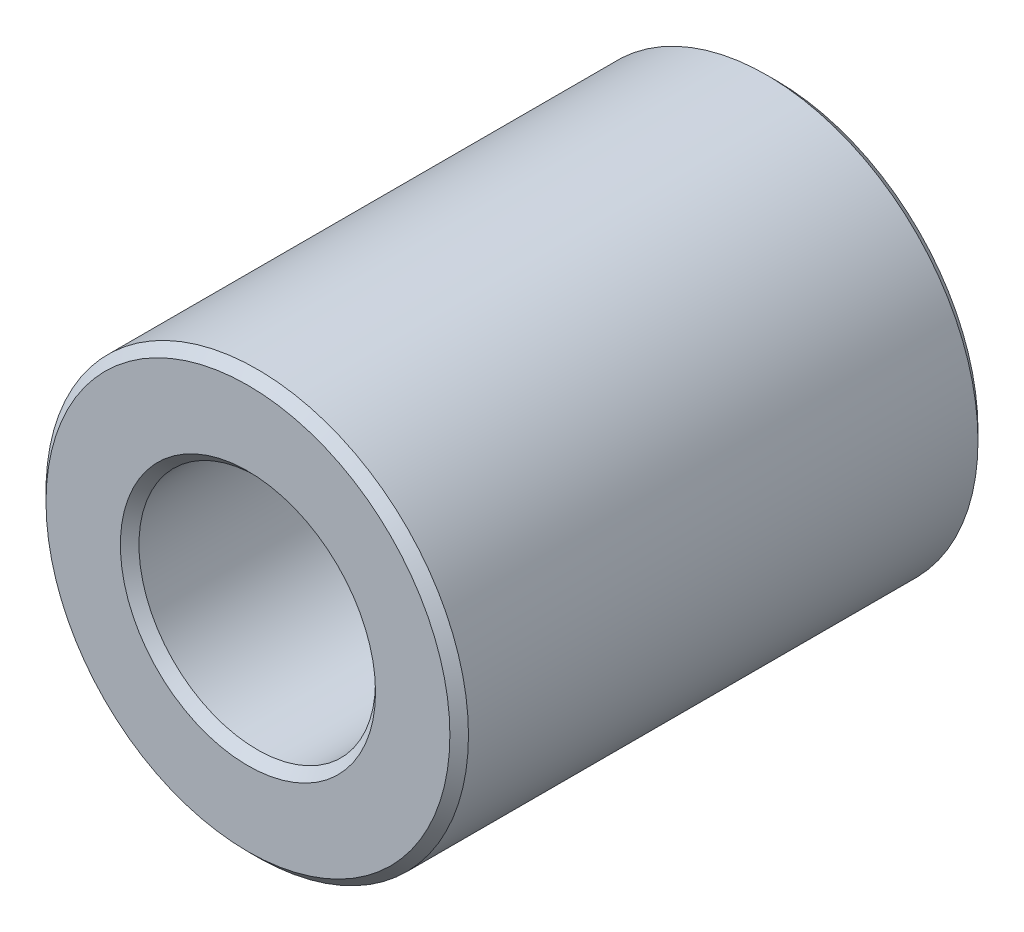
ISO-10303-21;
HEADER;
FILE_DESCRIPTION(('STEP AP214'),'2;1');
FILE_NAME('part.step','',(''),(''),'','','');
FILE_SCHEMA(('AUTOMOTIVE_DESIGN { 1 0 10303 214 1 1 1 1 }'));
ENDSEC;
DATA;
#1=APPLICATION_CONTEXT('core data for automotive mechanical design processes');
#2=APPLICATION_PROTOCOL_DEFINITION('international standard','automotive_design',2000,#1);
#3=PRODUCT_CONTEXT('',#1,'mechanical');
#4=PRODUCT('Part','Part','',(#3));
#5=PRODUCT_RELATED_PRODUCT_CATEGORY('part','',(#4));
#6=PRODUCT_DEFINITION_FORMATION('','',#4);
#7=PRODUCT_DEFINITION_CONTEXT('part definition',#1,'design');
#8=PRODUCT_DEFINITION('design','',#6,#7);
#9=PRODUCT_DEFINITION_SHAPE('','',#8);
#10=(LENGTH_UNIT() NAMED_UNIT(*) SI_UNIT(.MILLI.,.METRE.));
#11=(NAMED_UNIT(*) PLANE_ANGLE_UNIT() SI_UNIT($,.RADIAN.));
#12=(NAMED_UNIT(*) SI_UNIT($,.STERADIAN.) SOLID_ANGLE_UNIT());
#13=UNCERTAINTY_MEASURE_WITH_UNIT(LENGTH_MEASURE(1.E-05),#10,'distance_accuracy_value','');
#14=(GEOMETRIC_REPRESENTATION_CONTEXT(3) GLOBAL_UNCERTAINTY_ASSIGNED_CONTEXT((#13)) GLOBAL_UNIT_ASSIGNED_CONTEXT((#10,
#11,#12)) REPRESENTATION_CONTEXT('',''));
#15=CARTESIAN_POINT('',(0.,0.,0.));
#16=DIRECTION('',(0.,0.,1.));
#17=DIRECTION('',(1.,0.,0.));
#18=AXIS2_PLACEMENT_3D('',#15,#16,#17);
#19=CARTESIAN_POINT('',(0.,0.,-3.96875));
#20=DIRECTION('',(0.,0.,1.));
#21=DIRECTION('',(1.,0.,0.));
#22=AXIS2_PLACEMENT_3D('',#19,#20,#21);
#23=CYLINDRICAL_SURFACE('',#22,3.175);
#24=CARTESIAN_POINT('',(0.,0.,3.82905));
#25=DIRECTION('',(0.,0.,1.));
#26=DIRECTION('',(1.,0.,0.));
#27=AXIS2_PLACEMENT_3D('',#24,#25,#26);
#28=CIRCLE('',#27,3.175);
#29=CARTESIAN_POINT('',(3.175,0.,3.82905));
#30=VERTEX_POINT('',#29);
#31=EDGE_CURVE('E50',#30,#30,#28,.F.);
#32=CARTESIAN_POINT('',(0.,0.,-3.82905));
#33=DIRECTION('',(0.,0.,1.));
#34=DIRECTION('',(1.,0.,0.));
#35=AXIS2_PLACEMENT_3D('',#32,#33,#34);
#36=CIRCLE('',#35,3.175);
#37=CARTESIAN_POINT('',(3.175,0.,-3.82905));
#38=VERTEX_POINT('',#37);
#39=EDGE_CURVE('E53',#38,#38,#36,.T.);
#40=CARTESIAN_POINT('',(3.175,0.,3.82905));
#41=CARTESIAN_POINT('',(3.175,0.,3.749278125));
#42=CARTESIAN_POINT('',(3.175,0.,3.66950625));
#43=CARTESIAN_POINT('',(3.175,0.,3.5099625));
#44=CARTESIAN_POINT('',(3.175,0.,3.430190625));
#45=CARTESIAN_POINT('',(3.175,0.,3.270646875));
#46=CARTESIAN_POINT('',(3.175,0.,3.190875));
#47=CARTESIAN_POINT('',(3.175,0.,3.03133125));
#48=CARTESIAN_POINT('',(3.175,0.,2.951559375));
#49=CARTESIAN_POINT('',(3.175,0.,2.792015625));
#50=CARTESIAN_POINT('',(3.175,0.,2.71224375));
#51=CARTESIAN_POINT('',(3.175,0.,2.5527));
#52=CARTESIAN_POINT('',(3.175,0.,2.472928125));
#53=CARTESIAN_POINT('',(3.175,0.,2.313384375));
#54=CARTESIAN_POINT('',(3.175,0.,2.2336125));
#55=CARTESIAN_POINT('',(3.175,0.,2.07406875));
#56=CARTESIAN_POINT('',(3.175,0.,1.994296875));
#57=CARTESIAN_POINT('',(3.175,0.,1.834753125));
#58=CARTESIAN_POINT('',(3.175,0.,1.75498125));
#59=CARTESIAN_POINT('',(3.175,0.,1.5954375));
#60=CARTESIAN_POINT('',(3.175,0.,1.515665625));
#61=CARTESIAN_POINT('',(3.175,0.,1.356121875));
#62=CARTESIAN_POINT('',(3.175,0.,1.27635));
#63=CARTESIAN_POINT('',(3.175,0.,1.11680625));
#64=CARTESIAN_POINT('',(3.175,0.,1.037034375));
#65=CARTESIAN_POINT('',(3.175,0.,0.877490625));
#66=CARTESIAN_POINT('',(3.175,0.,0.79771875));
#67=CARTESIAN_POINT('',(3.175,0.,0.638175));
#68=CARTESIAN_POINT('',(3.175,0.,0.558403125));
#69=CARTESIAN_POINT('',(3.175,0.,0.398859375));
#70=CARTESIAN_POINT('',(3.175,0.,0.3190875));
#71=CARTESIAN_POINT('',(3.175,0.,0.15954375));
#72=CARTESIAN_POINT('',(3.175,0.,0.079771875));
#73=CARTESIAN_POINT('',(3.175,0.,-0.079771875));
#74=CARTESIAN_POINT('',(3.175,0.,-0.15954375));
#75=CARTESIAN_POINT('',(3.175,0.,-0.3190875));
#76=CARTESIAN_POINT('',(3.175,0.,-0.398859375));
#77=CARTESIAN_POINT('',(3.175,0.,-0.558403125));
#78=CARTESIAN_POINT('',(3.175,0.,-0.638175));
#79=CARTESIAN_POINT('',(3.175,0.,-0.79771875));
#80=CARTESIAN_POINT('',(3.175,0.,-0.877490625));
#81=CARTESIAN_POINT('',(3.175,0.,-1.037034375));
#82=CARTESIAN_POINT('',(3.175,0.,-1.11680625));
#83=CARTESIAN_POINT('',(3.175,0.,-1.27635));
#84=CARTESIAN_POINT('',(3.175,0.,-1.356121875));
#85=CARTESIAN_POINT('',(3.175,0.,-1.515665625));
#86=CARTESIAN_POINT('',(3.175,0.,-1.5954375));
#87=CARTESIAN_POINT('',(3.175,0.,-1.75498125));
#88=CARTESIAN_POINT('',(3.175,0.,-1.834753125));
#89=CARTESIAN_POINT('',(3.175,0.,-1.994296875));
#90=CARTESIAN_POINT('',(3.175,0.,-2.07406875));
#91=CARTESIAN_POINT('',(3.175,0.,-2.2336125));
#92=CARTESIAN_POINT('',(3.175,0.,-2.313384375));
#93=CARTESIAN_POINT('',(3.175,0.,-2.472928125));
#94=CARTESIAN_POINT('',(3.175,0.,-2.5527));
#95=CARTESIAN_POINT('',(3.175,0.,-2.71224375));
#96=CARTESIAN_POINT('',(3.175,0.,-2.792015625));
#97=CARTESIAN_POINT('',(3.175,0.,-2.951559375));
#98=CARTESIAN_POINT('',(3.175,0.,-3.03133125));
#99=CARTESIAN_POINT('',(3.175,0.,-3.190875));
#100=CARTESIAN_POINT('',(3.175,0.,-3.270646875));
#101=CARTESIAN_POINT('',(3.175,0.,-3.430190625));
#102=CARTESIAN_POINT('',(3.175,0.,-3.5099625));
#103=CARTESIAN_POINT('',(3.175,0.,-3.66950625));
#104=CARTESIAN_POINT('',(3.175,0.,-3.749278125));
#105=CARTESIAN_POINT('',(3.175,0.,-3.82905));
#106=B_SPLINE_CURVE_WITH_KNOTS('',3,(#40,#41,#42,#43,#44,#45,#46,#47,#48,#49,#50,#51,#52,#53,
#54,#55,#56,#57,#58,#59,#60,#61,#62,#63,#64,#65,#66,#67,#68,#69,#70,#71,#72,#73,#74,#75,#76,#77,
#78,#79,#80,#81,#82,#83,#84,#85,#86,#87,#88,#89,#90,#91,#92,#93,#94,#95,#96,#97,#98,#99,#100,
#101,#102,#103,#104,#105),.UNSPECIFIED.,.F.,.F.,(4,2,2,2,2,2,2,2,2,2,2,2,2,2,2,2,2,2,2,2,2,2,2,
2,2,2,2,2,2,2,2,2,4),(0.,0.239315625,0.47863125,0.717946875,0.9572625,1.196578125,1.43589375,
1.675209375,1.914525,2.153840625,2.39315625,2.632471875,2.8717875,3.111103125,3.35041875,
3.589734375,3.82905,4.068365625,4.30768125,4.546996875,4.7863125,5.025628125,5.26494375,
5.504259375,5.743575,5.982890625,6.22220625,6.461521875,6.7008375,6.940153125,7.17946875,
7.418784375,7.6581),.UNSPECIFIED.);
#107=EDGE_CURVE('BSEAM30',#30,#38,#106,.T.);
#108=ORIENTED_EDGE('',*,*,#31,.T.);
#109=ORIENTED_EDGE('',*,*,#39,.T.);
#110=ORIENTED_EDGE('',*,*,#107,.T.);
#111=ORIENTED_EDGE('',*,*,#107,.F.);
#112=EDGE_LOOP('',(#108,#110,#109,#111));
#113=FACE_BOUND('',#112,.T.);
#114=ADVANCED_FACE('F30',(#113),#23,.T.);
#115=CARTESIAN_POINT('',(0.,0.,-3.96875));
#116=DIRECTION('',(0.,0.,1.));
#117=DIRECTION('',(1.,0.,0.));
#118=AXIS2_PLACEMENT_3D('',#115,#116,#117);
#119=PLANE('',#118);
#120=CARTESIAN_POINT('',(0.,0.,-3.96875));
#121=DIRECTION('',(0.,0.,1.));
#122=DIRECTION('',(1.,0.,0.));
#123=AXIS2_PLACEMENT_3D('',#120,#121,#122);
#124=CIRCLE('',#123,3.0353);
#125=CARTESIAN_POINT('',(3.0353,0.,-3.96875));
#126=VERTEX_POINT('',#125);
#127=EDGE_CURVE('E41',#126,#126,#124,.F.);
#128=ORIENTED_EDGE('',*,*,#127,.T.);
#129=EDGE_LOOP('',(#128));
#130=FACE_BOUND('',#129,.T.);
#131=CARTESIAN_POINT('',(0.,0.,-3.96875));
#132=DIRECTION('',(0.,0.,1.));
#133=DIRECTION('',(1.,0.,0.));
#134=AXIS2_PLACEMENT_3D('',#131,#132,#133);
#135=CIRCLE('',#134,1.9177);
#136=CARTESIAN_POINT('',(-1.9177,0.,-3.96875));
#137=VERTEX_POINT('',#136);
#138=EDGE_CURVE('E45',#137,#137,#135,.T.);
#139=ORIENTED_EDGE('',*,*,#138,.T.);
#140=EDGE_LOOP('',(#139));
#141=FACE_BOUND('',#140,.T.);
#142=ADVANCED_FACE('F78',(#130,#141),#119,.F.);
#143=CARTESIAN_POINT('',(0.,0.,-3.96875));
#144=DIRECTION('',(0.,0.,1.));
#145=DIRECTION('',(1.,0.,0.));
#146=AXIS2_PLACEMENT_3D('',#143,#144,#145);
#147=CYLINDRICAL_SURFACE('',#146,1.778);
#148=CARTESIAN_POINT('',(0.,0.,3.82905));
#149=DIRECTION('',(0.,0.,1.));
#150=DIRECTION('',(1.,0.,0.));
#151=AXIS2_PLACEMENT_3D('',#148,#149,#150);
#152=CIRCLE('',#151,1.778);
#153=CARTESIAN_POINT('',(1.778,0.,3.82905));
#154=VERTEX_POINT('',#153);
#155=EDGE_CURVE('E10',#154,#154,#152,.T.);
#156=ORIENTED_EDGE('',*,*,#155,.T.);
#157=EDGE_LOOP('',(#156));
#158=FACE_BOUND('',#157,.T.);
#159=CARTESIAN_POINT('',(0.,0.,-3.82905));
#160=DIRECTION('',(0.,0.,1.));
#161=DIRECTION('',(1.,0.,0.));
#162=AXIS2_PLACEMENT_3D('',#159,#160,#161);
#163=CIRCLE('',#162,1.778);
#164=CARTESIAN_POINT('',(-1.778,0.,-3.82905));
#165=VERTEX_POINT('',#164);
#166=EDGE_CURVE('E37',#165,#165,#163,.F.);
#167=ORIENTED_EDGE('',*,*,#166,.T.);
#168=EDGE_LOOP('',(#167));
#169=FACE_BOUND('',#168,.T.);
#170=ADVANCED_FACE('F84',(#158,#169),#147,.F.);
#171=CARTESIAN_POINT('',(0.,0.,3.96875));
#172=DIRECTION('',(0.,0.,1.));
#173=DIRECTION('',(1.,0.,0.));
#174=AXIS2_PLACEMENT_3D('',#171,#172,#173);
#175=PLANE('',#174);
#176=CARTESIAN_POINT('',(0.,0.,3.96875));
#177=DIRECTION('',(0.,0.,1.));
#178=DIRECTION('',(1.,0.,0.));
#179=AXIS2_PLACEMENT_3D('',#176,#177,#178);
#180=CIRCLE('',#179,3.0353);
#181=CARTESIAN_POINT('',(3.0353,0.,3.96875));
#182=VERTEX_POINT('',#181);
#183=EDGE_CURVE('E56',#182,#182,#180,.T.);
#184=ORIENTED_EDGE('',*,*,#183,.T.);
#185=EDGE_LOOP('',(#184));
#186=FACE_BOUND('',#185,.T.);
#187=CARTESIAN_POINT('',(0.,0.,3.96875));
#188=DIRECTION('',(0.,0.,1.));
#189=DIRECTION('',(1.,0.,0.));
#190=AXIS2_PLACEMENT_3D('',#187,#188,#189);
#191=CIRCLE('',#190,1.9177);
#192=CARTESIAN_POINT('',(1.9177,0.,3.96875));
#193=VERTEX_POINT('',#192);
#194=EDGE_CURVE('E59',#193,#193,#191,.F.);
#195=ORIENTED_EDGE('',*,*,#194,.T.);
#196=EDGE_LOOP('',(#195));
#197=FACE_BOUND('',#196,.T.);
#198=ADVANCED_FACE('F63',(#186,#197),#175,.T.);
#199=CARTESIAN_POINT('',(0.,0.,3.96875));
#200=DIRECTION('',(0.,0.,-1.));
#201=DIRECTION('',(-1.,0.,0.));
#202=AXIS2_PLACEMENT_3D('',#199,#200,#201);
#203=CONICAL_SURFACE('',#202,3.0353,0.785398163397445);
#204=ORIENTED_EDGE('',*,*,#31,.F.);
#205=EDGE_LOOP('',(#204));
#206=FACE_BOUND('',#205,.T.);
#207=ORIENTED_EDGE('',*,*,#183,.F.);
#208=EDGE_LOOP('',(#207));
#209=FACE_BOUND('',#208,.T.);
#210=ADVANCED_FACE('F74',(#206,#209),#203,.T.);
#211=CARTESIAN_POINT('',(0.,0.,-3.82905));
#212=DIRECTION('',(0.,0.,1.));
#213=DIRECTION('',(1.,0.,0.));
#214=AXIS2_PLACEMENT_3D('',#211,#212,#213);
#215=CONICAL_SURFACE('',#214,3.175,0.785398163397448);
#216=CARTESIAN_POINT('',(3.0353,0.,-3.96875));
#217=CARTESIAN_POINT('',(3.03675520833333,0.,-3.96729479166667));
#218=CARTESIAN_POINT('',(3.03821041666667,0.,-3.96583958333333));
#219=CARTESIAN_POINT('',(3.04112083333333,0.,-3.96292916666667));
#220=CARTESIAN_POINT('',(3.04257604166667,0.,-3.96147395833333));
#221=CARTESIAN_POINT('',(3.04548645833333,0.,-3.95856354166667));
#222=CARTESIAN_POINT('',(3.04694166666667,0.,-3.95710833333333));
#223=CARTESIAN_POINT('',(3.04985208333333,0.,-3.95419791666667));
#224=CARTESIAN_POINT('',(3.05130729166667,0.,-3.95274270833333));
#225=CARTESIAN_POINT('',(3.05421770833333,0.,-3.94983229166667));
#226=CARTESIAN_POINT('',(3.05567291666667,0.,-3.94837708333333));
#227=CARTESIAN_POINT('',(3.05858333333333,0.,-3.94546666666667));
#228=CARTESIAN_POINT('',(3.06003854166667,0.,-3.94401145833333));
#229=CARTESIAN_POINT('',(3.06294895833333,0.,-3.94110104166667));
#230=CARTESIAN_POINT('',(3.06440416666667,0.,-3.93964583333333));
#231=CARTESIAN_POINT('',(3.06731458333333,0.,-3.93673541666667));
#232=CARTESIAN_POINT('',(3.06876979166667,0.,-3.93528020833333));
#233=CARTESIAN_POINT('',(3.07168020833333,0.,-3.93236979166667));
#234=CARTESIAN_POINT('',(3.07313541666667,0.,-3.93091458333333));
#235=CARTESIAN_POINT('',(3.07604583333333,0.,-3.92800416666667));
#236=CARTESIAN_POINT('',(3.07750104166667,0.,-3.92654895833333));
#237=CARTESIAN_POINT('',(3.08041145833333,0.,-3.92363854166667));
#238=CARTESIAN_POINT('',(3.08186666666667,0.,-3.92218333333333));
#239=CARTESIAN_POINT('',(3.08477708333333,0.,-3.91927291666667));
#240=CARTESIAN_POINT('',(3.08623229166667,0.,-3.91781770833333));
#241=CARTESIAN_POINT('',(3.08914270833333,0.,-3.91490729166667));
#242=CARTESIAN_POINT('',(3.09059791666667,0.,-3.91345208333333));
#243=CARTESIAN_POINT('',(3.09350833333333,0.,-3.91054166666667));
#244=CARTESIAN_POINT('',(3.09496354166667,0.,-3.90908645833333));
#245=CARTESIAN_POINT('',(3.09787395833333,0.,-3.90617604166667));
#246=CARTESIAN_POINT('',(3.09932916666667,0.,-3.90472083333333));
#247=CARTESIAN_POINT('',(3.10223958333333,0.,-3.90181041666667));
#248=CARTESIAN_POINT('',(3.10369479166667,0.,-3.90035520833333));
#249=CARTESIAN_POINT('',(3.10660520833333,0.,-3.89744479166667));
#250=CARTESIAN_POINT('',(3.10806041666667,0.,-3.89598958333333));
#251=CARTESIAN_POINT('',(3.11097083333333,0.,-3.89307916666667));
#252=CARTESIAN_POINT('',(3.11242604166667,0.,-3.89162395833333));
#253=CARTESIAN_POINT('',(3.11533645833333,0.,-3.88871354166667));
#254=CARTESIAN_POINT('',(3.11679166666667,0.,-3.88725833333333));
#255=CARTESIAN_POINT('',(3.11970208333333,0.,-3.88434791666667));
#256=CARTESIAN_POINT('',(3.12115729166667,0.,-3.88289270833333));
#257=CARTESIAN_POINT('',(3.12406770833333,0.,-3.87998229166667));
#258=CARTESIAN_POINT('',(3.12552291666667,0.,-3.87852708333333));
#259=CARTESIAN_POINT('',(3.12843333333333,0.,-3.87561666666667));
#260=CARTESIAN_POINT('',(3.12988854166667,0.,-3.87416145833333));
#261=CARTESIAN_POINT('',(3.13279895833333,0.,-3.87125104166667));
#262=CARTESIAN_POINT('',(3.13425416666667,0.,-3.86979583333333));
#263=CARTESIAN_POINT('',(3.13716458333333,0.,-3.86688541666667));
#264=CARTESIAN_POINT('',(3.13861979166667,0.,-3.86543020833333));
#265=CARTESIAN_POINT('',(3.14153020833333,0.,-3.86251979166667));
#266=CARTESIAN_POINT('',(3.14298541666667,0.,-3.86106458333333));
#267=CARTESIAN_POINT('',(3.14589583333333,0.,-3.85815416666667));
#268=CARTESIAN_POINT('',(3.14735104166667,0.,-3.85669895833333));
#269=CARTESIAN_POINT('',(3.15026145833333,0.,-3.85378854166667));
#270=CARTESIAN_POINT('',(3.15171666666667,0.,-3.85233333333333));
#271=CARTESIAN_POINT('',(3.15462708333333,0.,-3.84942291666667));
#272=CARTESIAN_POINT('',(3.15608229166667,0.,-3.84796770833333));
#273=CARTESIAN_POINT('',(3.15899270833333,0.,-3.84505729166667));
#274=CARTESIAN_POINT('',(3.16044791666667,0.,-3.84360208333333));
#275=CARTESIAN_POINT('',(3.16335833333333,0.,-3.84069166666667));
#276=CARTESIAN_POINT('',(3.16481354166667,0.,-3.83923645833333));
#277=CARTESIAN_POINT('',(3.16772395833333,0.,-3.83632604166667));
#278=CARTESIAN_POINT('',(3.16917916666667,0.,-3.83487083333333));
#279=CARTESIAN_POINT('',(3.17208958333333,0.,-3.83196041666667));
#280=CARTESIAN_POINT('',(3.17354479166667,0.,-3.83050520833333));
#281=CARTESIAN_POINT('',(3.175,0.,-3.82905));
#282=B_SPLINE_CURVE_WITH_KNOTS('',3,(#216,#217,#218,#219,#220,#221,#222,#223,#224,#225,#226,
#227,#228,#229,#230,#231,#232,#233,#234,#235,#236,#237,#238,#239,#240,#241,#242,#243,#244,#245,
#246,#247,#248,#249,#250,#251,#252,#253,#254,#255,#256,#257,#258,#259,#260,#261,#262,#263,#264,
#265,#266,#267,#268,#269,#270,#271,#272,#273,#274,#275,#276,#277,#278,#279,#280,#281),
.UNSPECIFIED.,.F.,.F.,(4,2,2,2,2,2,2,2,2,2,2,2,2,2,2,2,2,2,2,2,2,2,2,2,2,2,2,2,2,2,2,2,4),(0.,
0.00617392608323533,0.0123478521664704,0.0185217782497051,0.0246957043329401,0.0308696304161754,
0.0370435564994104,0.0432174825826452,0.0493914086658808,0.0555653347491158,0.0617392608323505,
0.0679131869155856,0.0740871129988209,0.0802610390820559,0.0864349651652906,0.092608891248526,
0.0987828173317607,0.104956743414996,0.111130669498231,0.117304595581466,0.123478521664701,
0.129652447747936,0.135826373831171,0.142000299914406,0.148174225997641,0.154348152080876,
0.160522078164111,0.166696004247346,0.172869930330581,0.179043856413816,0.185217782497051,
0.191391708580286,0.197565634663522),.UNSPECIFIED.);
#283=EDGE_CURVE('BSEAM68',#126,#38,#282,.T.);
#284=ORIENTED_EDGE('',*,*,#127,.F.);
#285=ORIENTED_EDGE('',*,*,#39,.F.);
#286=ORIENTED_EDGE('',*,*,#283,.T.);
#287=ORIENTED_EDGE('',*,*,#283,.F.);
#288=EDGE_LOOP('',(#284,#286,#285,#287));
#289=FACE_BOUND('',#288,.T.);
#290=ADVANCED_FACE('F68',(#289),#215,.T.);
#291=CARTESIAN_POINT('',(0.,0.,3.82905));
#292=DIRECTION('',(0.,0.,1.));
#293=DIRECTION('',(1.,0.,0.));
#294=AXIS2_PLACEMENT_3D('',#291,#292,#293);
#295=CONICAL_SURFACE('',#294,1.778,0.785398163397451);
#296=ORIENTED_EDGE('',*,*,#194,.F.);
#297=EDGE_LOOP('',(#296));
#298=FACE_BOUND('',#297,.T.);
#299=ORIENTED_EDGE('',*,*,#155,.F.);
#300=EDGE_LOOP('',(#299));
#301=FACE_BOUND('',#300,.T.);
#302=ADVANCED_FACE('F65',(#298,#301),#295,.F.);
#303=CARTESIAN_POINT('',(0.,0.,-3.96875));
#304=DIRECTION('',(0.,0.,-1.));
#305=DIRECTION('',(-1.,0.,0.));
#306=AXIS2_PLACEMENT_3D('',#303,#304,#305);
#307=CONICAL_SURFACE('',#306,1.9177,0.785398163397448);
#308=CARTESIAN_POINT('',(-1.778,0.,-3.82905));
#309=CARTESIAN_POINT('',(-1.77945520833333,0.,-3.83050520833333));
#310=CARTESIAN_POINT('',(-1.78091041666667,0.,-3.83196041666667));
#311=CARTESIAN_POINT('',(-1.78382083333333,0.,-3.83487083333333));
#312=CARTESIAN_POINT('',(-1.78527604166667,0.,-3.83632604166667));
#313=CARTESIAN_POINT('',(-1.78818645833333,0.,-3.83923645833333));
#314=CARTESIAN_POINT('',(-1.78964166666667,0.,-3.84069166666667));
#315=CARTESIAN_POINT('',(-1.79255208333333,0.,-3.84360208333333));
#316=CARTESIAN_POINT('',(-1.79400729166667,0.,-3.84505729166667));
#317=CARTESIAN_POINT('',(-1.79691770833333,0.,-3.84796770833333));
#318=CARTESIAN_POINT('',(-1.79837291666667,0.,-3.84942291666667));
#319=CARTESIAN_POINT('',(-1.80128333333333,0.,-3.85233333333333));
#320=CARTESIAN_POINT('',(-1.80273854166667,0.,-3.85378854166667));
#321=CARTESIAN_POINT('',(-1.80564895833333,0.,-3.85669895833333));
#322=CARTESIAN_POINT('',(-1.80710416666667,0.,-3.85815416666667));
#323=CARTESIAN_POINT('',(-1.81001458333333,0.,-3.86106458333333));
#324=CARTESIAN_POINT('',(-1.81146979166667,0.,-3.86251979166667));
#325=CARTESIAN_POINT('',(-1.81438020833333,0.,-3.86543020833333));
#326=CARTESIAN_POINT('',(-1.81583541666667,0.,-3.86688541666667));
#327=CARTESIAN_POINT('',(-1.81874583333333,0.,-3.86979583333333));
#328=CARTESIAN_POINT('',(-1.82020104166667,0.,-3.87125104166667));
#329=CARTESIAN_POINT('',(-1.82311145833333,0.,-3.87416145833333));
#330=CARTESIAN_POINT('',(-1.82456666666667,0.,-3.87561666666667));
#331=CARTESIAN_POINT('',(-1.82747708333333,0.,-3.87852708333333));
#332=CARTESIAN_POINT('',(-1.82893229166667,0.,-3.87998229166667));
#333=CARTESIAN_POINT('',(-1.83184270833333,0.,-3.88289270833333));
#334=CARTESIAN_POINT('',(-1.83329791666667,0.,-3.88434791666667));
#335=CARTESIAN_POINT('',(-1.83620833333333,0.,-3.88725833333333));
#336=CARTESIAN_POINT('',(-1.83766354166667,0.,-3.88871354166667));
#337=CARTESIAN_POINT('',(-1.84057395833333,0.,-3.89162395833333));
#338=CARTESIAN_POINT('',(-1.84202916666667,0.,-3.89307916666667));
#339=CARTESIAN_POINT('',(-1.84493958333333,0.,-3.89598958333333));
#340=CARTESIAN_POINT('',(-1.84639479166667,0.,-3.89744479166667));
#341=CARTESIAN_POINT('',(-1.84930520833333,0.,-3.90035520833333));
#342=CARTESIAN_POINT('',(-1.85076041666667,0.,-3.90181041666667));
#343=CARTESIAN_POINT('',(-1.85367083333333,0.,-3.90472083333333));
#344=CARTESIAN_POINT('',(-1.85512604166667,0.,-3.90617604166667));
#345=CARTESIAN_POINT('',(-1.85803645833333,0.,-3.90908645833333));
#346=CARTESIAN_POINT('',(-1.85949166666667,0.,-3.91054166666667));
#347=CARTESIAN_POINT('',(-1.86240208333333,0.,-3.91345208333333));
#348=CARTESIAN_POINT('',(-1.86385729166667,0.,-3.91490729166667));
#349=CARTESIAN_POINT('',(-1.86676770833333,0.,-3.91781770833333));
#350=CARTESIAN_POINT('',(-1.86822291666667,0.,-3.91927291666667));
#351=CARTESIAN_POINT('',(-1.87113333333333,0.,-3.92218333333333));
#352=CARTESIAN_POINT('',(-1.87258854166667,0.,-3.92363854166667));
#353=CARTESIAN_POINT('',(-1.87549895833333,0.,-3.92654895833333));
#354=CARTESIAN_POINT('',(-1.87695416666667,0.,-3.92800416666667));
#355=CARTESIAN_POINT('',(-1.87986458333333,0.,-3.93091458333333));
#356=CARTESIAN_POINT('',(-1.88131979166667,0.,-3.93236979166667));
#357=CARTESIAN_POINT('',(-1.88423020833333,0.,-3.93528020833333));
#358=CARTESIAN_POINT('',(-1.88568541666667,0.,-3.93673541666667));
#359=CARTESIAN_POINT('',(-1.88859583333333,0.,-3.93964583333333));
#360=CARTESIAN_POINT('',(-1.89005104166667,0.,-3.94110104166667));
#361=CARTESIAN_POINT('',(-1.89296145833333,0.,-3.94401145833333));
#362=CARTESIAN_POINT('',(-1.89441666666667,0.,-3.94546666666667));
#363=CARTESIAN_POINT('',(-1.89732708333333,0.,-3.94837708333333));
#364=CARTESIAN_POINT('',(-1.89878229166667,0.,-3.94983229166667));
#365=CARTESIAN_POINT('',(-1.90169270833333,0.,-3.95274270833333));
#366=CARTESIAN_POINT('',(-1.90314791666667,0.,-3.95419791666667));
#367=CARTESIAN_POINT('',(-1.90605833333333,0.,-3.95710833333333));
#368=CARTESIAN_POINT('',(-1.90751354166667,0.,-3.95856354166667));
#369=CARTESIAN_POINT('',(-1.91042395833333,0.,-3.96147395833333));
#370=CARTESIAN_POINT('',(-1.91187916666667,0.,-3.96292916666667));
#371=CARTESIAN_POINT('',(-1.91478958333333,0.,-3.96583958333333));
#372=CARTESIAN_POINT('',(-1.91624479166667,0.,-3.96729479166667));
#373=CARTESIAN_POINT('',(-1.9177,0.,-3.96875));
#374=B_SPLINE_CURVE_WITH_KNOTS('',3,(#308,#309,#310,#311,#312,#313,#314,#315,#316,#317,#318,
#319,#320,#321,#322,#323,#324,#325,#326,#327,#328,#329,#330,#331,#332,#333,#334,#335,#336,#337,
#338,#339,#340,#341,#342,#343,#344,#345,#346,#347,#348,#349,#350,#351,#352,#353,#354,#355,#356,
#357,#358,#359,#360,#361,#362,#363,#364,#365,#366,#367,#368,#369,#370,#371,#372,#373),
.UNSPECIFIED.,.F.,.F.,(4,2,2,2,2,2,2,2,2,2,2,2,2,2,2,2,2,2,2,2,2,2,2,2,2,2,2,2,2,2,2,2,4),(0.,
0.00617392608323487,0.01234785216647,0.0185217782497049,0.0246957043329401,0.030869630416175,
0.0370435564994101,0.043217482582645,0.0493914086658802,0.0555653347491151,0.0617392608323502,
0.0679131869155851,0.0740871129988203,0.0802610390820552,0.0864349651652903,0.0926088912485252,
0.0987828173317605,0.104956743414995,0.111130669498231,0.117304595581465,0.1234785216647,
0.129652447747936,0.135826373831171,0.142000299914406,0.14817422599764,0.154348152080876,
0.160522078164111,0.166696004247346,0.17286993033058,0.179043856413816,0.185217782497051,
0.191391708580286,0.197565634663521),.UNSPECIFIED.);
#375=EDGE_CURVE('BSEAM32',#165,#137,#374,.T.);
#376=ORIENTED_EDGE('',*,*,#166,.F.);
#377=ORIENTED_EDGE('',*,*,#138,.F.);
#378=ORIENTED_EDGE('',*,*,#375,.T.);
#379=ORIENTED_EDGE('',*,*,#375,.F.);
#380=EDGE_LOOP('',(#376,#378,#377,#379));
#381=FACE_BOUND('',#380,.T.);
#382=ADVANCED_FACE('F32',(#381),#307,.F.);
#383=CLOSED_SHELL('',(#114,#142,#170,#198,#210,#290,#302,#382));
#384=MANIFOLD_SOLID_BREP('B2',#383);
#385=ADVANCED_BREP_SHAPE_REPRESENTATION('',(#18,#384),#14);
#386=SHAPE_DEFINITION_REPRESENTATION(#9,#385);
ENDSEC;
END-ISO-10303-21;
